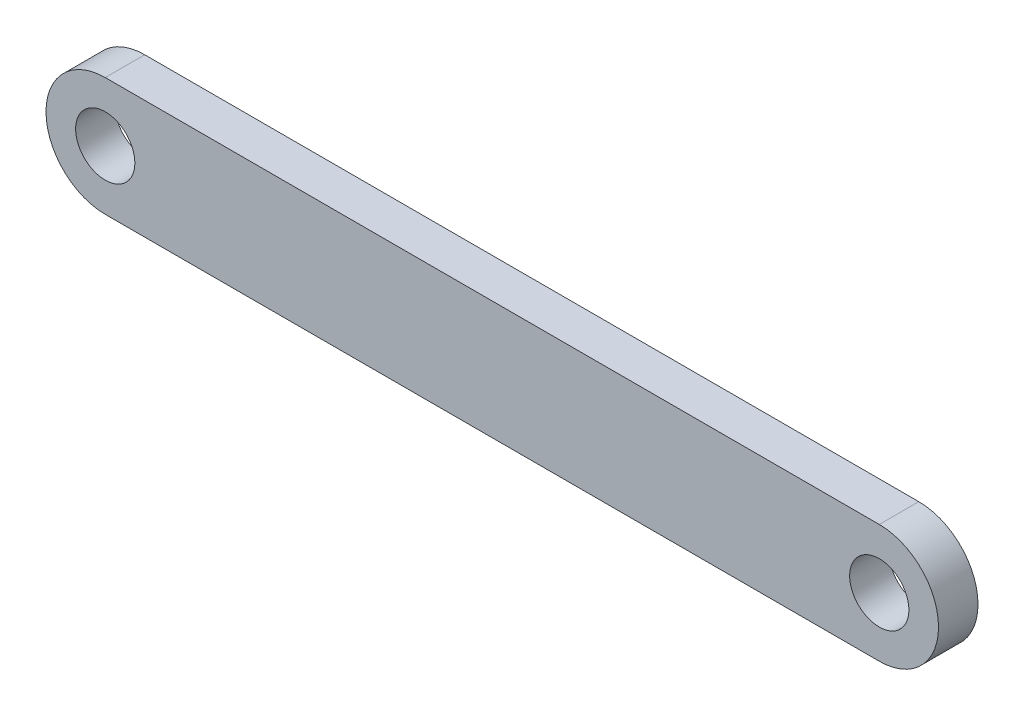
ISO-10303-21;
HEADER;
FILE_DESCRIPTION(('STEP AP214'),'2;1');
FILE_NAME('part.step','',(''),(''),'','','');
FILE_SCHEMA(('AUTOMOTIVE_DESIGN { 1 0 10303 214 1 1 1 1 }'));
ENDSEC;
DATA;
#1=APPLICATION_CONTEXT('core data for automotive mechanical design processes');
#2=APPLICATION_PROTOCOL_DEFINITION('international standard','automotive_design',2000,#1);
#3=PRODUCT_CONTEXT('',#1,'mechanical');
#4=PRODUCT('Part','Part','',(#3));
#5=PRODUCT_RELATED_PRODUCT_CATEGORY('part','',(#4));
#6=PRODUCT_DEFINITION_FORMATION('','',#4);
#7=PRODUCT_DEFINITION_CONTEXT('part definition',#1,'design');
#8=PRODUCT_DEFINITION('design','',#6,#7);
#9=PRODUCT_DEFINITION_SHAPE('','',#8);
#10=(LENGTH_UNIT() NAMED_UNIT(*) SI_UNIT(.MILLI.,.METRE.));
#11=(NAMED_UNIT(*) PLANE_ANGLE_UNIT() SI_UNIT($,.RADIAN.));
#12=(NAMED_UNIT(*) SI_UNIT($,.STERADIAN.) SOLID_ANGLE_UNIT());
#13=UNCERTAINTY_MEASURE_WITH_UNIT(LENGTH_MEASURE(1.E-05),#10,'distance_accuracy_value','');
#14=(GEOMETRIC_REPRESENTATION_CONTEXT(3) GLOBAL_UNCERTAINTY_ASSIGNED_CONTEXT((#13)) GLOBAL_UNIT_ASSIGNED_CONTEXT((#10,
#11,#12)) REPRESENTATION_CONTEXT('',''));
#15=CARTESIAN_POINT('',(0.,0.,0.));
#16=DIRECTION('',(0.,0.,1.));
#17=DIRECTION('',(1.,0.,0.));
#18=AXIS2_PLACEMENT_3D('',#15,#16,#17);
#19=CARTESIAN_POINT('',(71.366619711762,9.525,6.35));
#20=DIRECTION('',(0.,0.,-1.));
#21=DIRECTION('',(-1.,0.,0.));
#22=AXIS2_PLACEMENT_3D('',#19,#20,#21);
#23=CYLINDRICAL_SURFACE('',#22,9.525);
#24=DIRECTION('',(0.,0.,-1.));
#25=VECTOR('',#24,1.);
#26=CARTESIAN_POINT('',(71.366619711762,19.05,6.35));
#27=LINE('',#26,#25);
#28=CARTESIAN_POINT('',(71.366619711762,19.05,6.35));
#29=VERTEX_POINT('',#28);
#30=CARTESIAN_POINT('',(71.366619711762,19.05,0.));
#31=VERTEX_POINT('',#30);
#32=EDGE_CURVE('E89',#29,#31,#27,.T.);
#33=ORIENTED_EDGE('',*,*,#32,.F.);
#34=CARTESIAN_POINT('',(71.366619711762,9.525,6.35));
#35=DIRECTION('',(0.,0.,1.));
#36=DIRECTION('',(1.,0.,0.));
#37=AXIS2_PLACEMENT_3D('',#34,#35,#36);
#38=CIRCLE('',#37,9.525);
#39=CARTESIAN_POINT('',(71.366619711762,0.,6.35));
#40=VERTEX_POINT('',#39);
#41=EDGE_CURVE('E52',#40,#29,#38,.T.);
#42=ORIENTED_EDGE('',*,*,#41,.F.);
#43=DIRECTION('',(0.,0.,-1.));
#44=VECTOR('',#43,1.);
#45=CARTESIAN_POINT('',(71.366619711762,0.,6.35));
#46=LINE('',#45,#44);
#47=CARTESIAN_POINT('',(71.366619711762,0.,0.));
#48=VERTEX_POINT('',#47);
#49=EDGE_CURVE('E114',#48,#40,#46,.F.);
#50=ORIENTED_EDGE('',*,*,#49,.F.);
#51=CARTESIAN_POINT('',(71.366619711762,9.525,0.));
#52=DIRECTION('',(0.,0.,1.));
#53=DIRECTION('',(1.,0.,0.));
#54=AXIS2_PLACEMENT_3D('',#51,#52,#53);
#55=CIRCLE('',#54,9.525);
#56=EDGE_CURVE('E11',#31,#48,#55,.F.);
#57=ORIENTED_EDGE('',*,*,#56,.F.);
#58=EDGE_LOOP('',(#33,#42,#50,#57));
#59=FACE_BOUND('',#58,.T.);
#60=ADVANCED_FACE('F44',(#59),#23,.T.);
#61=CARTESIAN_POINT('',(-53.093380288238,9.525,0.));
#62=DIRECTION('',(0.,0.,-1.));
#63=DIRECTION('',(-1.,0.,0.));
#64=AXIS2_PLACEMENT_3D('',#61,#62,#63);
#65=CYLINDRICAL_SURFACE('',#64,9.525);
#66=DIRECTION('',(0.,0.,-1.));
#67=VECTOR('',#66,1.);
#68=CARTESIAN_POINT('',(-53.093380288238,19.05,6.35));
#69=LINE('',#68,#67);
#70=CARTESIAN_POINT('',(-53.093380288238,19.05,0.));
#71=VERTEX_POINT('',#70);
#72=CARTESIAN_POINT('',(-53.093380288238,19.05,6.35));
#73=VERTEX_POINT('',#72);
#74=EDGE_CURVE('E90',#71,#73,#69,.F.);
#75=ORIENTED_EDGE('',*,*,#74,.F.);
#76=CARTESIAN_POINT('',(-53.093380288238,9.525,0.));
#77=DIRECTION('',(0.,0.,1.));
#78=DIRECTION('',(1.,0.,0.));
#79=AXIS2_PLACEMENT_3D('',#76,#77,#78);
#80=CIRCLE('',#79,9.525);
#81=CARTESIAN_POINT('',(-53.093380288238,0.,0.));
#82=VERTEX_POINT('',#81);
#83=EDGE_CURVE('E94',#82,#71,#80,.F.);
#84=ORIENTED_EDGE('',*,*,#83,.F.);
#85=DIRECTION('',(0.,0.,-1.));
#86=VECTOR('',#85,1.);
#87=CARTESIAN_POINT('',(-53.093380288238,0.,6.35));
#88=LINE('',#87,#86);
#89=CARTESIAN_POINT('',(-53.093380288238,0.,6.35));
#90=VERTEX_POINT('',#89);
#91=EDGE_CURVE('E101',#90,#82,#88,.T.);
#92=ORIENTED_EDGE('',*,*,#91,.F.);
#93=CARTESIAN_POINT('',(-53.093380288238,9.525,6.35));
#94=DIRECTION('',(0.,0.,1.));
#95=DIRECTION('',(1.,0.,0.));
#96=AXIS2_PLACEMENT_3D('',#93,#94,#95);
#97=CIRCLE('',#96,9.525);
#98=EDGE_CURVE('E99',#73,#90,#97,.T.);
#99=ORIENTED_EDGE('',*,*,#98,.F.);
#100=EDGE_LOOP('',(#75,#84,#92,#99));
#101=FACE_BOUND('',#100,.T.);
#102=ADVANCED_FACE('F102',(#101),#65,.T.);
#103=CARTESIAN_POINT('',(-62.618380288238,0.,6.35));
#104=DIRECTION('',(0.,1.,0.));
#105=DIRECTION('',(0.,0.,1.));
#106=AXIS2_PLACEMENT_3D('',#103,#104,#105);
#107=PLANE('',#106);
#108=DIRECTION('',(1.,0.,0.));
#109=VECTOR('',#108,1.);
#110=CARTESIAN_POINT('',(-62.618380288238,0.,0.));
#111=LINE('',#110,#109);
#112=EDGE_CURVE('E95',#82,#48,#111,.T.);
#113=ORIENTED_EDGE('',*,*,#112,.T.);
#114=ORIENTED_EDGE('',*,*,#49,.T.);
#115=DIRECTION('',(1.,0.,0.));
#116=VECTOR('',#115,1.);
#117=CARTESIAN_POINT('',(-62.618380288238,0.,6.35));
#118=LINE('',#117,#116);
#119=EDGE_CURVE('E93',#90,#40,#118,.T.);
#120=ORIENTED_EDGE('',*,*,#119,.F.);
#121=ORIENTED_EDGE('',*,*,#91,.T.);
#122=EDGE_LOOP('',(#113,#114,#120,#121));
#123=FACE_BOUND('',#122,.T.);
#124=ADVANCED_FACE('F120',(#123),#107,.F.);
#125=CARTESIAN_POINT('',(-62.618380288238,19.05,6.35));
#126=DIRECTION('',(0.,-1.,0.));
#127=DIRECTION('',(0.,0.,-1.));
#128=AXIS2_PLACEMENT_3D('',#125,#126,#127);
#129=PLANE('',#128);
#130=DIRECTION('',(-1.,0.,0.));
#131=VECTOR('',#130,1.);
#132=CARTESIAN_POINT('',(-62.618380288238,19.05,6.35));
#133=LINE('',#132,#131);
#134=EDGE_CURVE('E104',#29,#73,#133,.T.);
#135=ORIENTED_EDGE('',*,*,#134,.F.);
#136=ORIENTED_EDGE('',*,*,#32,.T.);
#137=DIRECTION('',(-1.,0.,0.));
#138=VECTOR('',#137,1.);
#139=CARTESIAN_POINT('',(-62.618380288238,19.05,0.));
#140=LINE('',#139,#138);
#141=EDGE_CURVE('E81',#31,#71,#140,.T.);
#142=ORIENTED_EDGE('',*,*,#141,.T.);
#143=ORIENTED_EDGE('',*,*,#74,.T.);
#144=EDGE_LOOP('',(#135,#136,#142,#143));
#145=FACE_BOUND('',#144,.T.);
#146=ADVANCED_FACE('F87',(#145),#129,.F.);
#147=CARTESIAN_POINT('',(0.,0.,6.35));
#148=DIRECTION('',(0.,0.,1.));
#149=DIRECTION('',(1.,0.,0.));
#150=AXIS2_PLACEMENT_3D('',#147,#148,#149);
#151=PLANE('',#150);
#152=CARTESIAN_POINT('',(-53.093380288238,9.52499999999998,6.35));
#153=DIRECTION('',(0.,0.,1.));
#154=DIRECTION('',(1.,0.,0.));
#155=AXIS2_PLACEMENT_3D('',#152,#153,#154);
#156=CIRCLE('',#155,4.7625);
#157=CARTESIAN_POINT('',(-48.330880288238,9.52499999999998,6.35));
#158=VERTEX_POINT('',#157);
#159=EDGE_CURVE('E116',#158,#158,#156,.T.);
#160=ORIENTED_EDGE('',*,*,#159,.F.);
#161=EDGE_LOOP('',(#160));
#162=FACE_BOUND('',#161,.T.);
#163=CARTESIAN_POINT('',(71.366619711762,9.52499999999998,6.35));
#164=DIRECTION('',(0.,0.,1.));
#165=DIRECTION('',(1.,0.,0.));
#166=AXIS2_PLACEMENT_3D('',#163,#164,#165);
#167=CIRCLE('',#166,4.7625);
#168=CARTESIAN_POINT('',(76.129119711762,9.52499999999998,6.35));
#169=VERTEX_POINT('',#168);
#170=EDGE_CURVE('E127',#169,#169,#167,.T.);
#171=ORIENTED_EDGE('',*,*,#170,.F.);
#172=EDGE_LOOP('',(#171));
#173=FACE_BOUND('',#172,.T.);
#174=ORIENTED_EDGE('',*,*,#119,.T.);
#175=ORIENTED_EDGE('',*,*,#41,.T.);
#176=ORIENTED_EDGE('',*,*,#134,.T.);
#177=ORIENTED_EDGE('',*,*,#98,.T.);
#178=EDGE_LOOP('',(#174,#175,#176,#177));
#179=FACE_BOUND('',#178,.T.);
#180=ADVANCED_FACE('F118',(#162,#173,#179),#151,.T.);
#181=CARTESIAN_POINT('',(0.,0.,0.));
#182=DIRECTION('',(0.,0.,1.));
#183=DIRECTION('',(1.,0.,0.));
#184=AXIS2_PLACEMENT_3D('',#181,#182,#183);
#185=PLANE('',#184);
#186=CARTESIAN_POINT('',(-53.093380288238,9.52499999999998,0.));
#187=DIRECTION('',(0.,0.,1.));
#188=DIRECTION('',(1.,0.,0.));
#189=AXIS2_PLACEMENT_3D('',#186,#187,#188);
#190=CIRCLE('',#189,4.7625);
#191=CARTESIAN_POINT('',(-48.330880288238,9.52499999999998,0.));
#192=VERTEX_POINT('',#191);
#193=EDGE_CURVE('E125',#192,#192,#190,.T.);
#194=ORIENTED_EDGE('',*,*,#193,.T.);
#195=EDGE_LOOP('',(#194));
#196=FACE_BOUND('',#195,.T.);
#197=CARTESIAN_POINT('',(71.366619711762,9.52499999999998,0.));
#198=DIRECTION('',(0.,0.,1.));
#199=DIRECTION('',(1.,0.,0.));
#200=AXIS2_PLACEMENT_3D('',#197,#198,#199);
#201=CIRCLE('',#200,4.7625);
#202=CARTESIAN_POINT('',(76.129119711762,9.52499999999998,0.));
#203=VERTEX_POINT('',#202);
#204=EDGE_CURVE('E129',#203,#203,#201,.T.);
#205=ORIENTED_EDGE('',*,*,#204,.T.);
#206=EDGE_LOOP('',(#205));
#207=FACE_BOUND('',#206,.T.);
#208=ORIENTED_EDGE('',*,*,#141,.F.);
#209=ORIENTED_EDGE('',*,*,#56,.T.);
#210=ORIENTED_EDGE('',*,*,#112,.F.);
#211=ORIENTED_EDGE('',*,*,#83,.T.);
#212=EDGE_LOOP('',(#208,#209,#210,#211));
#213=FACE_BOUND('',#212,.T.);
#214=ADVANCED_FACE('F92',(#196,#207,#213),#185,.F.);
#215=CARTESIAN_POINT('',(71.366619711762,9.52499999999998,6.35));
#216=DIRECTION('',(0.,0.,-1.));
#217=DIRECTION('',(-1.,0.,0.));
#218=AXIS2_PLACEMENT_3D('',#215,#216,#217);
#219=CYLINDRICAL_SURFACE('',#218,4.7625);
#220=ORIENTED_EDGE('',*,*,#170,.T.);
#221=EDGE_LOOP('',(#220));
#222=FACE_BOUND('',#221,.T.);
#223=ORIENTED_EDGE('',*,*,#204,.F.);
#224=EDGE_LOOP('',(#223));
#225=FACE_BOUND('',#224,.T.);
#226=ADVANCED_FACE('F136',(#222,#225),#219,.F.);
#227=CARTESIAN_POINT('',(-53.093380288238,9.52499999999998,6.35));
#228=DIRECTION('',(0.,0.,-1.));
#229=DIRECTION('',(-1.,0.,0.));
#230=AXIS2_PLACEMENT_3D('',#227,#228,#229);
#231=CYLINDRICAL_SURFACE('',#230,4.7625);
#232=ORIENTED_EDGE('',*,*,#159,.T.);
#233=EDGE_LOOP('',(#232));
#234=FACE_BOUND('',#233,.T.);
#235=ORIENTED_EDGE('',*,*,#193,.F.);
#236=EDGE_LOOP('',(#235));
#237=FACE_BOUND('',#236,.T.);
#238=ADVANCED_FACE('F140',(#234,#237),#231,.F.);
#239=CLOSED_SHELL('',(#60,#102,#124,#146,#180,#214,#226,#238));
#240=MANIFOLD_SOLID_BREP('B2',#239);
#241=ADVANCED_BREP_SHAPE_REPRESENTATION('',(#18,#240),#14);
#242=SHAPE_DEFINITION_REPRESENTATION(#9,#241);
ENDSEC;
END-ISO-10303-21;
